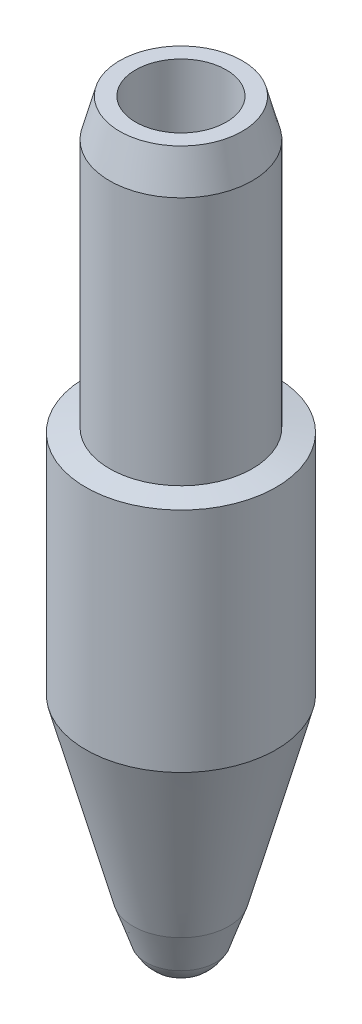
ISO-10303-21;
HEADER;
FILE_DESCRIPTION(('STEP AP214'),'2;1');
FILE_NAME('part.step','',(''),(''),'','','');
FILE_SCHEMA(('AUTOMOTIVE_DESIGN { 1 0 10303 214 1 1 1 1 }'));
ENDSEC;
DATA;
#1=APPLICATION_CONTEXT('core data for automotive mechanical design processes');
#2=APPLICATION_PROTOCOL_DEFINITION('international standard','automotive_design',2000,#1);
#3=PRODUCT_CONTEXT('',#1,'mechanical');
#4=PRODUCT('Part','Part','',(#3));
#5=PRODUCT_RELATED_PRODUCT_CATEGORY('part','',(#4));
#6=PRODUCT_DEFINITION_FORMATION('','',#4);
#7=PRODUCT_DEFINITION_CONTEXT('part definition',#1,'design');
#8=PRODUCT_DEFINITION('design','',#6,#7);
#9=PRODUCT_DEFINITION_SHAPE('','',#8);
#10=(LENGTH_UNIT() NAMED_UNIT(*) SI_UNIT(.MILLI.,.METRE.));
#11=(NAMED_UNIT(*) PLANE_ANGLE_UNIT() SI_UNIT($,.RADIAN.));
#12=(NAMED_UNIT(*) SI_UNIT($,.STERADIAN.) SOLID_ANGLE_UNIT());
#13=UNCERTAINTY_MEASURE_WITH_UNIT(LENGTH_MEASURE(1.E-05),#10,'distance_accuracy_value','');
#14=(GEOMETRIC_REPRESENTATION_CONTEXT(3) GLOBAL_UNCERTAINTY_ASSIGNED_CONTEXT((#13)) GLOBAL_UNIT_ASSIGNED_CONTEXT((#10,
#11,#12)) REPRESENTATION_CONTEXT('',''));
#15=CARTESIAN_POINT('',(0.,0.,0.));
#16=DIRECTION('',(0.,0.,1.));
#17=DIRECTION('',(1.,0.,0.));
#18=AXIS2_PLACEMENT_3D('',#15,#16,#17);
#19=CARTESIAN_POINT('',(0.,0.2,0.));
#20=DIRECTION('',(0.,1.,0.));
#21=DIRECTION('',(1.,0.,0.));
#22=AXIS2_PLACEMENT_3D('',#19,#20,#21);
#23=SPHERICAL_SURFACE('',#22,0.5);
#24=CARTESIAN_POINT('',(0.,0.7,0.));
#25=VERTEX_POINT('',#24);
#26=VERTEX_LOOP('',#25);
#27=FACE_BOUND('',#26,.T.);
#28=ADVANCED_FACE('F42',(#27),#23,.T.);
#29=CLOSED_SHELL('',(#28));
#30=MANIFOLD_SOLID_BREP('B2',#29);
#31=CARTESIAN_POINT('',(0.150244132795622,0.,0.));
#32=DIRECTION('',(0.,-1.,0.));
#33=DIRECTION('',(0.,0.,-1.));
#34=AXIS2_PLACEMENT_3D('',#31,#32,#33);
#35=PLANE('',#34);
#36=CARTESIAN_POINT('',(0.,0.,0.));
#37=DIRECTION('',(0.,-1.,0.));
#38=DIRECTION('',(0.,0.,-1.));
#39=AXIS2_PLACEMENT_3D('',#36,#37,#38);
#40=CIRCLE('',#39,0.462113613750148);
#41=CARTESIAN_POINT('',(0.,0.,-0.462113613750148));
#42=VERTEX_POINT('',#41);
#43=EDGE_CURVE('E41',#42,#42,#40,.T.);
#44=ORIENTED_EDGE('',*,*,#43,.T.);
#45=EDGE_LOOP('',(#44));
#46=FACE_BOUND('',#45,.T.);
#47=CARTESIAN_POINT('',(0.,0.,0.));
#48=DIRECTION('',(0.,-1.,0.));
#49=DIRECTION('',(0.,0.,-1.));
#50=AXIS2_PLACEMENT_3D('',#47,#48,#49);
#51=CIRCLE('',#50,0.150244132795622);
#52=CARTESIAN_POINT('',(0.,0.,-0.150244132795622));
#53=VERTEX_POINT('',#52);
#54=EDGE_CURVE('E109',#53,#53,#51,.T.);
#55=ORIENTED_EDGE('',*,*,#54,.F.);
#56=EDGE_LOOP('',(#55));
#57=FACE_BOUND('',#56,.T.);
#58=ADVANCED_FACE('F56',(#46,#57),#35,.T.);
#59=CARTESIAN_POINT('',(0.,0.,0.));
#60=DIRECTION('',(0.,1.,0.));
#61=DIRECTION('',(0.,0.,1.));
#62=AXIS2_PLACEMENT_3D('',#59,#60,#61);
#63=CONICAL_SURFACE('',#62,0.462113613750148,0.331071004076838);
#64=CARTESIAN_POINT('',(0.,0.5,0.));
#65=DIRECTION('',(0.,-1.,0.));
#66=DIRECTION('',(0.,0.,-1.));
#67=AXIS2_PLACEMENT_3D('',#64,#65,#66);
#68=CIRCLE('',#67,0.633974596215562);
#69=CARTESIAN_POINT('',(0.,0.5,-0.633974596215562));
#70=VERTEX_POINT('',#69);
#71=EDGE_CURVE('E63',#70,#70,#68,.T.);
#72=ORIENTED_EDGE('',*,*,#71,.T.);
#73=EDGE_LOOP('',(#72));
#74=FACE_BOUND('',#73,.T.);
#75=ORIENTED_EDGE('',*,*,#43,.F.);
#76=EDGE_LOOP('',(#75));
#77=FACE_BOUND('',#76,.T.);
#78=ADVANCED_FACE('F119',(#74,#77),#63,.T.);
#79=CARTESIAN_POINT('',(0.,0.5,0.));
#80=DIRECTION('',(0.,1.,0.));
#81=DIRECTION('',(0.,0.,1.));
#82=AXIS2_PLACEMENT_3D('',#79,#80,#81);
#83=CONICAL_SURFACE('',#82,0.633974596215562,0.26179938779915);
#84=CARTESIAN_POINT('',(0.,2.83635861375234,0.));
#85=DIRECTION('',(0.,-1.,0.));
#86=DIRECTION('',(0.,0.,-1.));
#87=AXIS2_PLACEMENT_3D('',#84,#85,#86);
#88=CIRCLE('',#87,1.26);
#89=CARTESIAN_POINT('',(0.,2.83635861375234,-1.26));
#90=VERTEX_POINT('',#89);
#91=EDGE_CURVE('E69',#90,#90,#88,.T.);
#92=ORIENTED_EDGE('',*,*,#91,.T.);
#93=EDGE_LOOP('',(#92));
#94=FACE_BOUND('',#93,.T.);
#95=ORIENTED_EDGE('',*,*,#71,.F.);
#96=EDGE_LOOP('',(#95));
#97=FACE_BOUND('',#96,.T.);
#98=ADVANCED_FACE('F123',(#94,#97),#83,.T.);
#99=CARTESIAN_POINT('',(0.,0.,0.));
#100=DIRECTION('',(0.,-1.,0.));
#101=DIRECTION('',(0.,0.,-1.));
#102=AXIS2_PLACEMENT_3D('',#99,#100,#101);
#103=CYLINDRICAL_SURFACE('',#102,1.26);
#104=CARTESIAN_POINT('',(0.,5.84445700107683,0.));
#105=DIRECTION('',(0.,-1.,0.));
#106=DIRECTION('',(0.,0.,-1.));
#107=AXIS2_PLACEMENT_3D('',#104,#105,#106);
#108=CIRCLE('',#107,1.26);
#109=CARTESIAN_POINT('',(0.,5.84445700107683,-1.26));
#110=VERTEX_POINT('',#109);
#111=EDGE_CURVE('E75',#110,#110,#108,.T.);
#112=ORIENTED_EDGE('',*,*,#111,.T.);
#113=EDGE_LOOP('',(#112));
#114=FACE_BOUND('',#113,.T.);
#115=ORIENTED_EDGE('',*,*,#91,.F.);
#116=EDGE_LOOP('',(#115));
#117=FACE_BOUND('',#116,.T.);
#118=ADVANCED_FACE('F127',(#114,#117),#103,.T.);
#119=CARTESIAN_POINT('',(0.,5.84445700107683,0.));
#120=DIRECTION('',(0.,-1.,0.));
#121=DIRECTION('',(0.,0.,-1.));
#122=AXIS2_PLACEMENT_3D('',#119,#120,#121);
#123=CONICAL_SURFACE('',#122,1.26,1.39626340159546);
#124=CARTESIAN_POINT('',(0.,5.9,0.));
#125=DIRECTION('',(0.,-1.,0.));
#126=DIRECTION('',(0.,0.,-1.));
#127=AXIS2_PLACEMENT_3D('',#124,#125,#126);
#128=CIRCLE('',#127,0.945);
#129=CARTESIAN_POINT('',(0.,5.9,-0.945));
#130=VERTEX_POINT('',#129);
#131=EDGE_CURVE('E81',#130,#130,#128,.T.);
#132=ORIENTED_EDGE('',*,*,#131,.T.);
#133=EDGE_LOOP('',(#132));
#134=FACE_BOUND('',#133,.T.);
#135=ORIENTED_EDGE('',*,*,#111,.F.);
#136=EDGE_LOOP('',(#135));
#137=FACE_BOUND('',#136,.T.);
#138=ADVANCED_FACE('F134',(#134,#137),#123,.T.);
#139=CARTESIAN_POINT('',(0.,0.,0.));
#140=DIRECTION('',(0.,-1.,0.));
#141=DIRECTION('',(0.,0.,-1.));
#142=AXIS2_PLACEMENT_3D('',#139,#140,#141);
#143=CYLINDRICAL_SURFACE('',#142,0.945);
#144=CARTESIAN_POINT('',(0.,9.2,0.));
#145=DIRECTION('',(0.,-1.,0.));
#146=DIRECTION('',(0.,0.,-1.));
#147=AXIS2_PLACEMENT_3D('',#144,#145,#146);
#148=CIRCLE('',#147,0.945);
#149=CARTESIAN_POINT('',(0.,9.2,-0.945));
#150=VERTEX_POINT('',#149);
#151=EDGE_CURVE('E85',#150,#150,#148,.T.);
#152=ORIENTED_EDGE('',*,*,#151,.T.);
#153=EDGE_LOOP('',(#152));
#154=FACE_BOUND('',#153,.T.);
#155=ORIENTED_EDGE('',*,*,#131,.F.);
#156=EDGE_LOOP('',(#155));
#157=FACE_BOUND('',#156,.T.);
#158=ADVANCED_FACE('F138',(#154,#157),#143,.T.);
#159=CARTESIAN_POINT('',(0.,9.2,0.));
#160=DIRECTION('',(0.,-1.,0.));
#161=DIRECTION('',(0.,0.,-1.));
#162=AXIS2_PLACEMENT_3D('',#159,#160,#161);
#163=CONICAL_SURFACE('',#162,0.945,0.261799387799151);
#164=CARTESIAN_POINT('',(0.,9.7,0.));
#165=DIRECTION('',(0.,-1.,0.));
#166=DIRECTION('',(0.,0.,-1.));
#167=AXIS2_PLACEMENT_3D('',#164,#165,#166);
#168=CIRCLE('',#167,0.811025403784438);
#169=CARTESIAN_POINT('',(0.,9.7,-0.811025403784438));
#170=VERTEX_POINT('',#169);
#171=EDGE_CURVE('E89',#170,#170,#168,.T.);
#172=ORIENTED_EDGE('',*,*,#171,.T.);
#173=EDGE_LOOP('',(#172));
#174=FACE_BOUND('',#173,.T.);
#175=ORIENTED_EDGE('',*,*,#151,.F.);
#176=EDGE_LOOP('',(#175));
#177=FACE_BOUND('',#176,.T.);
#178=ADVANCED_FACE('F142',(#174,#177),#163,.T.);
#179=CARTESIAN_POINT('',(0.811025403784438,9.7,0.));
#180=DIRECTION('',(0.,1.,0.));
#181=DIRECTION('',(0.,0.,1.));
#182=AXIS2_PLACEMENT_3D('',#179,#180,#181);
#183=PLANE('',#182);
#184=CARTESIAN_POINT('',(0.,9.7,0.));
#185=DIRECTION('',(0.,-1.,0.));
#186=DIRECTION('',(0.,0.,-1.));
#187=AXIS2_PLACEMENT_3D('',#184,#185,#186);
#188=CIRCLE('',#187,0.6);
#189=CARTESIAN_POINT('',(0.,9.7,-0.6));
#190=VERTEX_POINT('',#189);
#191=EDGE_CURVE('E93',#190,#190,#188,.T.);
#192=ORIENTED_EDGE('',*,*,#191,.T.);
#193=EDGE_LOOP('',(#192));
#194=FACE_BOUND('',#193,.T.);
#195=ORIENTED_EDGE('',*,*,#171,.F.);
#196=EDGE_LOOP('',(#195));
#197=FACE_BOUND('',#196,.T.);
#198=ADVANCED_FACE('F146',(#194,#197),#183,.T.);
#199=CARTESIAN_POINT('',(0.,0.,0.));
#200=DIRECTION('',(0.,-1.,0.));
#201=DIRECTION('',(0.,0.,-1.));
#202=AXIS2_PLACEMENT_3D('',#199,#200,#201);
#203=CYLINDRICAL_SURFACE('',#202,0.6);
#204=CARTESIAN_POINT('',(0.,4.2,0.));
#205=DIRECTION('',(0.,-1.,0.));
#206=DIRECTION('',(0.,0.,-1.));
#207=AXIS2_PLACEMENT_3D('',#204,#205,#206);
#208=CIRCLE('',#207,0.600000000000001);
#209=CARTESIAN_POINT('',(0.,4.2,-0.600000000000001));
#210=VERTEX_POINT('',#209);
#211=EDGE_CURVE('E97',#210,#210,#208,.T.);
#212=ORIENTED_EDGE('',*,*,#211,.T.);
#213=EDGE_LOOP('',(#212));
#214=FACE_BOUND('',#213,.T.);
#215=ORIENTED_EDGE('',*,*,#191,.F.);
#216=EDGE_LOOP('',(#215));
#217=FACE_BOUND('',#216,.T.);
#218=ADVANCED_FACE('F150',(#214,#217),#203,.F.);
#219=CARTESIAN_POINT('',(0.,4.2,0.));
#220=DIRECTION('',(0.,1.,0.));
#221=DIRECTION('',(0.,0.,1.));
#222=AXIS2_PLACEMENT_3D('',#219,#220,#221);
#223=CONICAL_SURFACE('',#222,0.600000000000001,1.04719755119659);
#224=CARTESIAN_POINT('',(0.,4.11339745962156,0.));
#225=DIRECTION('',(0.,-1.,0.));
#226=DIRECTION('',(0.,0.,-1.));
#227=AXIS2_PLACEMENT_3D('',#224,#225,#226);
#228=CIRCLE('',#227,0.45);
#229=CARTESIAN_POINT('',(0.,4.11339745962156,-0.45));
#230=VERTEX_POINT('',#229);
#231=EDGE_CURVE('E101',#230,#230,#228,.T.);
#232=ORIENTED_EDGE('',*,*,#231,.T.);
#233=EDGE_LOOP('',(#232));
#234=FACE_BOUND('',#233,.T.);
#235=ORIENTED_EDGE('',*,*,#211,.F.);
#236=EDGE_LOOP('',(#235));
#237=FACE_BOUND('',#236,.T.);
#238=ADVANCED_FACE('F154',(#234,#237),#223,.F.);
#239=CARTESIAN_POINT('',(0.,0.,0.));
#240=DIRECTION('',(0.,-1.,0.));
#241=DIRECTION('',(0.,0.,-1.));
#242=AXIS2_PLACEMENT_3D('',#239,#240,#241);
#243=CYLINDRICAL_SURFACE('',#242,0.45);
#244=CARTESIAN_POINT('',(0.,1.7,0.));
#245=DIRECTION('',(0.,-1.,0.));
#246=DIRECTION('',(0.,0.,-1.));
#247=AXIS2_PLACEMENT_3D('',#244,#245,#246);
#248=CIRCLE('',#247,0.450000000000001);
#249=CARTESIAN_POINT('',(0.,1.7,-0.450000000000001));
#250=VERTEX_POINT('',#249);
#251=EDGE_CURVE('E105',#250,#250,#248,.T.);
#252=ORIENTED_EDGE('',*,*,#251,.T.);
#253=EDGE_LOOP('',(#252));
#254=FACE_BOUND('',#253,.T.);
#255=ORIENTED_EDGE('',*,*,#231,.F.);
#256=EDGE_LOOP('',(#255));
#257=FACE_BOUND('',#256,.T.);
#258=ADVANCED_FACE('F158',(#254,#257),#243,.F.);
#259=CARTESIAN_POINT('',(0.,1.7,0.));
#260=DIRECTION('',(0.,1.,0.));
#261=DIRECTION('',(0.,0.,1.));
#262=AXIS2_PLACEMENT_3D('',#259,#260,#261);
#263=CONICAL_SURFACE('',#262,0.450000000000001,0.174532925199426);
#264=ORIENTED_EDGE('',*,*,#54,.T.);
#265=EDGE_LOOP('',(#264));
#266=FACE_BOUND('',#265,.T.);
#267=ORIENTED_EDGE('',*,*,#251,.F.);
#268=EDGE_LOOP('',(#267));
#269=FACE_BOUND('',#268,.T.);
#270=ADVANCED_FACE('F115',(#266,#269),#263,.F.);
#271=CLOSED_SHELL('',(#58,#78,#98,#118,#138,#158,#178,#198,#218,#238,#258,#270));
#272=MANIFOLD_SOLID_BREP('B6',#271);
#273=ADVANCED_BREP_SHAPE_REPRESENTATION('',(#18,#30,#272),#14);
#274=SHAPE_DEFINITION_REPRESENTATION(#9,#273);
ENDSEC;
END-ISO-10303-21;
